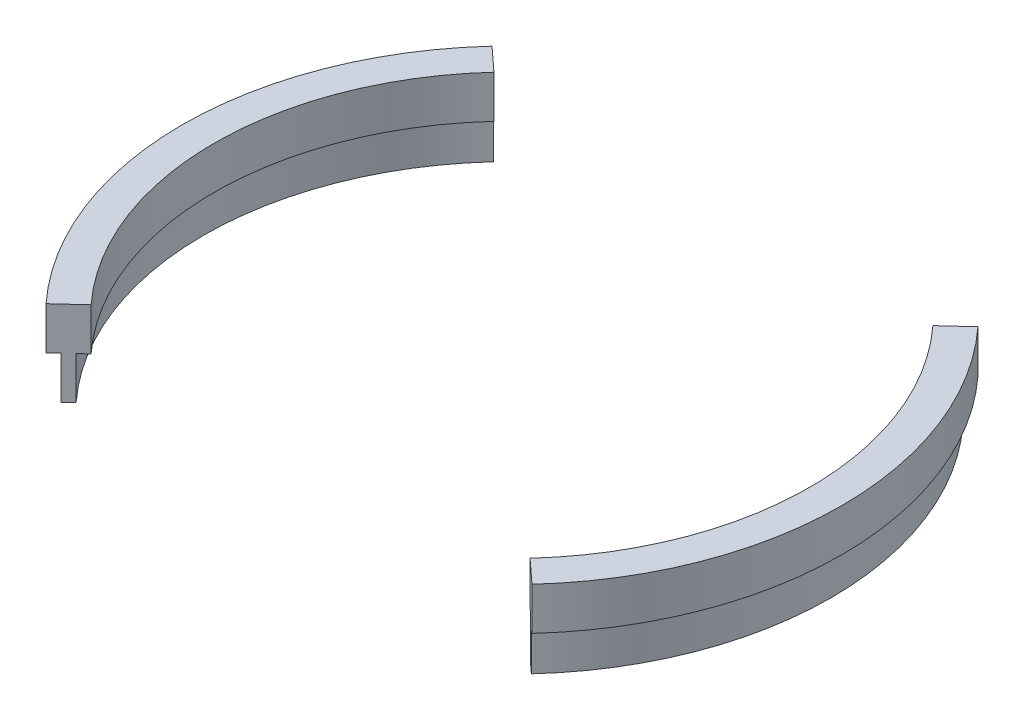
ISO-10303-21;
HEADER;
FILE_DESCRIPTION(('STEP AP214'),'2;1');
FILE_NAME('part.step','',(''),(''),'','','');
FILE_SCHEMA(('AUTOMOTIVE_DESIGN { 1 0 10303 214 1 1 1 1 }'));
ENDSEC;
DATA;
#1=APPLICATION_CONTEXT('core data for automotive mechanical design processes');
#2=APPLICATION_PROTOCOL_DEFINITION('international standard','automotive_design',2000,#1);
#3=PRODUCT_CONTEXT('',#1,'mechanical');
#4=PRODUCT('Part','Part','',(#3));
#5=PRODUCT_RELATED_PRODUCT_CATEGORY('part','',(#4));
#6=PRODUCT_DEFINITION_FORMATION('','',#4);
#7=PRODUCT_DEFINITION_CONTEXT('part definition',#1,'design');
#8=PRODUCT_DEFINITION('design','',#6,#7);
#9=PRODUCT_DEFINITION_SHAPE('','',#8);
#10=(LENGTH_UNIT() NAMED_UNIT(*) SI_UNIT(.MILLI.,.METRE.));
#11=(NAMED_UNIT(*) PLANE_ANGLE_UNIT() SI_UNIT($,.RADIAN.));
#12=(NAMED_UNIT(*) SI_UNIT($,.STERADIAN.) SOLID_ANGLE_UNIT());
#13=UNCERTAINTY_MEASURE_WITH_UNIT(LENGTH_MEASURE(1.E-05),#10,'distance_accuracy_value','');
#14=(GEOMETRIC_REPRESENTATION_CONTEXT(3) GLOBAL_UNCERTAINTY_ASSIGNED_CONTEXT((#13)) GLOBAL_UNIT_ASSIGNED_CONTEXT((#10,
#11,#12)) REPRESENTATION_CONTEXT('',''));
#15=CARTESIAN_POINT('',(0.,0.,0.));
#16=DIRECTION('',(0.,0.,1.));
#17=DIRECTION('',(1.,0.,0.));
#18=AXIS2_PLACEMENT_3D('',#15,#16,#17);
#19=CARTESIAN_POINT('',(1.39496655754129,4.,16.8267841003418));
#20=DIRECTION('',(0.,-1.,0.));
#21=DIRECTION('',(0.,0.,-1.));
#22=AXIS2_PLACEMENT_3D('',#19,#20,#21);
#23=CYLINDRICAL_SURFACE('',#22,29.0000000000001);
#24=CARTESIAN_POINT('',(1.39496655754129,0.,16.8267841003418));
#25=DIRECTION('',(0.,-1.,0.));
#26=DIRECTION('',(0.,0.,1.));
#27=AXIS2_PLACEMENT_3D('',#24,#25,#26);
#28=CIRCLE('',#27,29.0000000000001);
#29=CARTESIAN_POINT('',(-19.9706746071511,0.,36.4356947692597));
#30=VERTEX_POINT('',#29);
#31=CARTESIAN_POINT('',(-19.9706746071511,0.,-2.78212656857616));
#32=VERTEX_POINT('',#31);
#33=EDGE_CURVE('E12',#30,#32,#28,.T.);
#34=ORIENTED_EDGE('',*,*,#33,.T.);
#35=DIRECTION('',(0.,-1.,0.));
#36=VECTOR('',#35,1.);
#37=CARTESIAN_POINT('',(-19.9706746071511,4.,-2.78212656857616));
#38=LINE('',#37,#36);
#39=CARTESIAN_POINT('',(-19.9706746071511,4.,-2.78212656857616));
#40=VERTEX_POINT('',#39);
#41=EDGE_CURVE('E87',#40,#32,#38,.T.);
#42=ORIENTED_EDGE('',*,*,#41,.F.);
#43=CARTESIAN_POINT('',(1.39496655754129,4.,16.8267841003418));
#44=DIRECTION('',(0.,-1.,0.));
#45=DIRECTION('',(0.,0.,1.));
#46=AXIS2_PLACEMENT_3D('',#43,#44,#45);
#47=CIRCLE('',#46,29.0000000000001);
#48=CARTESIAN_POINT('',(-19.9706746071511,4.,36.4356947692597));
#49=VERTEX_POINT('',#48);
#50=EDGE_CURVE('E52',#49,#40,#47,.T.);
#51=ORIENTED_EDGE('',*,*,#50,.F.);
#52=DIRECTION('',(0.,-1.,0.));
#53=VECTOR('',#52,1.);
#54=CARTESIAN_POINT('',(-19.9706746071511,4.,36.4356947692597));
#55=LINE('',#54,#53);
#56=EDGE_CURVE('E163',#49,#30,#55,.T.);
#57=ORIENTED_EDGE('',*,*,#56,.T.);
#58=EDGE_LOOP('',(#34,#42,#51,#57));
#59=FACE_BOUND('',#58,.T.);
#60=ADVANCED_FACE('F47',(#59),#23,.F.);
#61=CARTESIAN_POINT('',(-20.7074208542095,4.,-3.45829590198712));
#62=DIRECTION('',(-0.676169333410963,0.,0.736746247058357));
#63=DIRECTION('',(0.736746247058357,0.,0.676169333410963));
#64=AXIS2_PLACEMENT_3D('',#61,#62,#63);
#65=PLANE('',#64);
#66=DIRECTION('',(-0.736746247058357,0.,-0.676169333410963));
#67=VECTOR('',#66,1.);
#68=CARTESIAN_POINT('',(-20.7074208542095,0.,-3.45829590198712));
#69=LINE('',#68,#67);
#70=CARTESIAN_POINT('',(-20.7074208542095,0.,-3.45829590198712));
#71=VERTEX_POINT('',#70);
#72=EDGE_CURVE('E56',#32,#71,#69,.T.);
#73=ORIENTED_EDGE('',*,*,#72,.T.);
#74=DIRECTION('',(0.,-1.,0.));
#75=VECTOR('',#74,1.);
#76=CARTESIAN_POINT('',(-20.7074208542095,4.,-3.45829590198712));
#77=LINE('',#76,#75);
#78=CARTESIAN_POINT('',(-20.7074208542095,4.,-3.45829590198712));
#79=VERTEX_POINT('',#78);
#80=EDGE_CURVE('E81',#79,#71,#77,.T.);
#81=ORIENTED_EDGE('',*,*,#80,.F.);
#82=DIRECTION('',(-0.736746247058359,0.,-0.676169333410962));
#83=VECTOR('',#82,1.);
#84=CARTESIAN_POINT('',(-21.4441671012583,4.,-4.13446523540854));
#85=LINE('',#84,#83);
#86=CARTESIAN_POINT('',(-21.4441671012583,4.,-4.13446523540854));
#87=VERTEX_POINT('',#86);
#88=EDGE_CURVE('E123',#79,#87,#85,.T.);
#89=ORIENTED_EDGE('',*,*,#88,.T.);
#90=DIRECTION('',(0.,-1.,0.));
#91=VECTOR('',#90,1.);
#92=CARTESIAN_POINT('',(-21.4441671012583,8.,-4.13446523540854));
#93=LINE('',#92,#91);
#94=CARTESIAN_POINT('',(-21.4441671012583,8.,-4.13446523540854));
#95=VERTEX_POINT('',#94);
#96=EDGE_CURVE('E126',#95,#87,#93,.T.);
#97=ORIENTED_EDGE('',*,*,#96,.F.);
#98=DIRECTION('',(-0.736746247058359,0.,-0.676169333410962));
#99=VECTOR('',#98,1.);
#100=CARTESIAN_POINT('',(-21.4441671012583,8.,-4.13446523540854));
#101=LINE('',#100,#99);
#102=CARTESIAN_POINT('',(-19.2339283600832,8.,-2.10595723517566));
#103=VERTEX_POINT('',#102);
#104=EDGE_CURVE('E142',#103,#95,#101,.T.);
#105=ORIENTED_EDGE('',*,*,#104,.F.);
#106=DIRECTION('',(0.,-1.,0.));
#107=VECTOR('',#106,1.);
#108=CARTESIAN_POINT('',(-19.2339283600832,8.,-2.10595723517566));
#109=LINE('',#108,#107);
#110=CARTESIAN_POINT('',(-19.2339283600832,4.,-2.10595723517566));
#111=VERTEX_POINT('',#110);
#112=EDGE_CURVE('E141',#103,#111,#109,.T.);
#113=ORIENTED_EDGE('',*,*,#112,.T.);
#114=EDGE_CURVE('E134',#111,#40,#85,.T.);
#115=ORIENTED_EDGE('',*,*,#114,.T.);
#116=ORIENTED_EDGE('',*,*,#41,.T.);
#117=EDGE_LOOP('',(#73,#81,#89,#97,#105,#113,#115,#116));
#118=FACE_BOUND('',#117,.T.);
#119=ADVANCED_FACE('F127',(#118),#65,.F.);
#120=CARTESIAN_POINT('',(1.39496655754129,4.,16.8267841003418));
#121=DIRECTION('',(0.,-1.,0.));
#122=DIRECTION('',(0.,0.,-1.));
#123=AXIS2_PLACEMENT_3D('',#120,#121,#122);
#124=CYLINDRICAL_SURFACE('',#123,30.0000000000001);
#125=CARTESIAN_POINT('',(1.39496655754129,0.,16.8267841003418));
#126=DIRECTION('',(0.,1.,0.));
#127=DIRECTION('',(0.,0.,1.));
#128=AXIS2_PLACEMENT_3D('',#125,#126,#127);
#129=CIRCLE('',#128,30.0000000000001);
#130=CARTESIAN_POINT('',(-20.7074208542095,0.,37.1118641026707));
#131=VERTEX_POINT('',#130);
#132=EDGE_CURVE('E169',#71,#131,#129,.T.);
#133=ORIENTED_EDGE('',*,*,#132,.T.);
#134=DIRECTION('',(0.,-1.,0.));
#135=VECTOR('',#134,1.);
#136=CARTESIAN_POINT('',(-20.7074208542095,4.,37.1118641026707));
#137=LINE('',#136,#135);
#138=CARTESIAN_POINT('',(-20.7074208542191,4.,37.1118641026602));
#139=VERTEX_POINT('',#138);
#140=EDGE_CURVE('E165',#139,#131,#137,.T.);
#141=ORIENTED_EDGE('',*,*,#140,.F.);
#142=CARTESIAN_POINT('',(1.39496655754129,4.,16.8267841003418));
#143=DIRECTION('',(0.,1.,0.));
#144=DIRECTION('',(0.,0.,1.));
#145=AXIS2_PLACEMENT_3D('',#142,#143,#144);
#146=CIRCLE('',#145,30.0000000000001);
#147=EDGE_CURVE('E167',#79,#139,#146,.T.);
#148=ORIENTED_EDGE('',*,*,#147,.F.);
#149=ORIENTED_EDGE('',*,*,#80,.T.);
#150=EDGE_LOOP('',(#133,#141,#148,#149));
#151=FACE_BOUND('',#150,.T.);
#152=ADVANCED_FACE('F210',(#151),#124,.T.);
#153=CARTESIAN_POINT('',(-20.7074208542095,4.,37.1118641026707));
#154=DIRECTION('',(-0.676169333410963,0.,-0.736746247058357));
#155=DIRECTION('',(-0.736746247058357,0.,0.676169333410963));
#156=AXIS2_PLACEMENT_3D('',#153,#154,#155);
#157=PLANE('',#156);
#158=DIRECTION('',(0.736746247058357,0.,-0.676169333410963));
#159=VECTOR('',#158,1.);
#160=CARTESIAN_POINT('',(-20.7074208542095,0.,37.1118641026707));
#161=LINE('',#160,#159);
#162=EDGE_CURVE('E94',#131,#30,#161,.T.);
#163=ORIENTED_EDGE('',*,*,#162,.T.);
#164=ORIENTED_EDGE('',*,*,#56,.F.);
#165=DIRECTION('',(0.736746247058359,0.,-0.676169333410962));
#166=VECTOR('',#165,1.);
#167=CARTESIAN_POINT('',(-19.2339283601024,4.,35.7595254358383));
#168=LINE('',#167,#166);
#169=CARTESIAN_POINT('',(-19.2339283601024,4.,35.7595254358383));
#170=VERTEX_POINT('',#169);
#171=EDGE_CURVE('E151',#49,#170,#168,.T.);
#172=ORIENTED_EDGE('',*,*,#171,.T.);
#173=DIRECTION('',(0.,-1.,0.));
#174=VECTOR('',#173,1.);
#175=CARTESIAN_POINT('',(-19.2339283601024,8.,35.7595254358383));
#176=LINE('',#175,#174);
#177=CARTESIAN_POINT('',(-19.2339283601024,8.,35.7595254358383));
#178=VERTEX_POINT('',#177);
#179=EDGE_CURVE('E182',#178,#170,#176,.T.);
#180=ORIENTED_EDGE('',*,*,#179,.F.);
#181=DIRECTION('',(0.736746247058359,0.,-0.676169333410962));
#182=VECTOR('',#181,1.);
#183=CARTESIAN_POINT('',(-19.2339283601024,8.,35.7595254358383));
#184=LINE('',#183,#182);
#185=CARTESIAN_POINT('',(-21.4441671012775,8.,37.7880334360712));
#186=VERTEX_POINT('',#185);
#187=EDGE_CURVE('E158',#186,#178,#184,.T.);
#188=ORIENTED_EDGE('',*,*,#187,.F.);
#189=DIRECTION('',(0.,-1.,0.));
#190=VECTOR('',#189,1.);
#191=CARTESIAN_POINT('',(-21.4441671012775,8.,37.7880334360712));
#192=LINE('',#191,#190);
#193=CARTESIAN_POINT('',(-21.4441671012775,4.,37.7880334360712));
#194=VERTEX_POINT('',#193);
#195=EDGE_CURVE('E184',#186,#194,#192,.T.);
#196=ORIENTED_EDGE('',*,*,#195,.T.);
#197=EDGE_CURVE('E150',#194,#139,#168,.T.);
#198=ORIENTED_EDGE('',*,*,#197,.T.);
#199=ORIENTED_EDGE('',*,*,#140,.T.);
#200=EDGE_LOOP('',(#163,#164,#172,#180,#188,#196,#198,#199));
#201=FACE_BOUND('',#200,.T.);
#202=ADVANCED_FACE('F183',(#201),#157,.F.);
#203=CARTESIAN_POINT('',(1.39496655754129,0.,16.8267841003418));
#204=DIRECTION('',(0.,1.,0.));
#205=DIRECTION('',(0.,0.,1.));
#206=AXIS2_PLACEMENT_3D('',#203,#204,#205);
#207=PLANE('',#206);
#208=ORIENTED_EDGE('',*,*,#33,.F.);
#209=ORIENTED_EDGE('',*,*,#162,.F.);
#210=ORIENTED_EDGE('',*,*,#132,.F.);
#211=ORIENTED_EDGE('',*,*,#72,.F.);
#212=EDGE_LOOP('',(#208,#209,#210,#211));
#213=FACE_BOUND('',#212,.T.);
#214=ADVANCED_FACE('F51',(#213),#207,.F.);
#215=CARTESIAN_POINT('',(1.39496655754129,4.,16.8267841003418));
#216=DIRECTION('',(0.,1.,0.));
#217=DIRECTION('',(0.,0.,1.));
#218=AXIS2_PLACEMENT_3D('',#215,#216,#217);
#219=PLANE('',#218);
#220=ORIENTED_EDGE('',*,*,#171,.F.);
#221=ORIENTED_EDGE('',*,*,#50,.T.);
#222=ORIENTED_EDGE('',*,*,#114,.F.);
#223=CARTESIAN_POINT('',(1.39496655754129,4.,16.8267841003418));
#224=DIRECTION('',(0.,-1.,0.));
#225=DIRECTION('',(0.,0.,1.));
#226=AXIS2_PLACEMENT_3D('',#223,#224,#225);
#227=CIRCLE('',#226,28.0000000000001);
#228=EDGE_CURVE('E179',#170,#111,#227,.T.);
#229=ORIENTED_EDGE('',*,*,#228,.F.);
#230=EDGE_LOOP('',(#220,#221,#222,#229));
#231=FACE_BOUND('',#230,.T.);
#232=ADVANCED_FACE('F171',(#231),#219,.F.);
#233=CARTESIAN_POINT('',(1.39496655754129,8.,16.8267841003418));
#234=DIRECTION('',(0.,-1.,0.));
#235=DIRECTION('',(0.,0.,-1.));
#236=AXIS2_PLACEMENT_3D('',#233,#234,#235);
#237=CYLINDRICAL_SURFACE('',#236,31.0000000000001);
#238=CARTESIAN_POINT('',(1.39496655754129,4.,16.8267841003418));
#239=DIRECTION('',(0.,1.,0.));
#240=DIRECTION('',(0.,0.,1.));
#241=AXIS2_PLACEMENT_3D('',#238,#239,#240);
#242=CIRCLE('',#241,31.0000000000001);
#243=EDGE_CURVE('E140',#87,#194,#242,.T.);
#244=ORIENTED_EDGE('',*,*,#243,.T.);
#245=ORIENTED_EDGE('',*,*,#195,.F.);
#246=CARTESIAN_POINT('',(1.39496655754129,8.,16.8267841003418));
#247=DIRECTION('',(0.,1.,0.));
#248=DIRECTION('',(0.,0.,1.));
#249=AXIS2_PLACEMENT_3D('',#246,#247,#248);
#250=CIRCLE('',#249,31.0000000000001);
#251=EDGE_CURVE('E131',#95,#186,#250,.T.);
#252=ORIENTED_EDGE('',*,*,#251,.F.);
#253=ORIENTED_EDGE('',*,*,#96,.T.);
#254=EDGE_LOOP('',(#244,#245,#252,#253));
#255=FACE_BOUND('',#254,.T.);
#256=ADVANCED_FACE('F139',(#255),#237,.T.);
#257=CARTESIAN_POINT('',(1.39496655754129,8.,16.8267841003418));
#258=DIRECTION('',(0.,-1.,0.));
#259=DIRECTION('',(0.,0.,-1.));
#260=AXIS2_PLACEMENT_3D('',#257,#258,#259);
#261=CYLINDRICAL_SURFACE('',#260,28.0000000000001);
#262=ORIENTED_EDGE('',*,*,#228,.T.);
#263=ORIENTED_EDGE('',*,*,#112,.F.);
#264=CARTESIAN_POINT('',(1.39496655754129,8.,16.8267841003418));
#265=DIRECTION('',(0.,-1.,0.));
#266=DIRECTION('',(0.,0.,1.));
#267=AXIS2_PLACEMENT_3D('',#264,#265,#266);
#268=CIRCLE('',#267,28.0000000000001);
#269=EDGE_CURVE('E156',#178,#103,#268,.T.);
#270=ORIENTED_EDGE('',*,*,#269,.F.);
#271=ORIENTED_EDGE('',*,*,#179,.T.);
#272=EDGE_LOOP('',(#262,#263,#270,#271));
#273=FACE_BOUND('',#272,.T.);
#274=ADVANCED_FACE('F191',(#273),#261,.F.);
#275=CARTESIAN_POINT('',(1.39496655754129,8.,16.8267841003418));
#276=DIRECTION('',(0.,1.,0.));
#277=DIRECTION('',(0.,0.,1.));
#278=AXIS2_PLACEMENT_3D('',#275,#276,#277);
#279=PLANE('',#278);
#280=ORIENTED_EDGE('',*,*,#251,.T.);
#281=ORIENTED_EDGE('',*,*,#187,.T.);
#282=ORIENTED_EDGE('',*,*,#269,.T.);
#283=ORIENTED_EDGE('',*,*,#104,.T.);
#284=EDGE_LOOP('',(#280,#281,#282,#283));
#285=FACE_BOUND('',#284,.T.);
#286=ADVANCED_FACE('F186',(#285),#279,.T.);
#287=ORIENTED_EDGE('',*,*,#88,.F.);
#288=ORIENTED_EDGE('',*,*,#147,.T.);
#289=ORIENTED_EDGE('',*,*,#197,.F.);
#290=ORIENTED_EDGE('',*,*,#243,.F.);
#291=EDGE_LOOP('',(#287,#288,#289,#290));
#292=FACE_BOUND('',#291,.T.);
#293=ADVANCED_FACE('F144',(#292),#219,.F.);
#294=CLOSED_SHELL('',(#60,#119,#152,#202,#214,#232,#256,#274,#286,#293));
#295=MANIFOLD_SOLID_BREP('B2',#294);
#296=CARTESIAN_POINT('',(1.39496655754129,4.,16.8267841003418));
#297=DIRECTION('',(0.,-1.,0.));
#298=DIRECTION('',(0.,0.,-1.));
#299=AXIS2_PLACEMENT_3D('',#296,#297,#298);
#300=CYLINDRICAL_SURFACE('',#299,29.0000000000001);
#301=CARTESIAN_POINT('',(1.39496655754129,0.,16.8267841003418));
#302=DIRECTION('',(0.,-1.,0.));
#303=DIRECTION('',(0.,0.,1.));
#304=AXIS2_PLACEMENT_3D('',#301,#302,#303);
#305=CIRCLE('',#304,29.0000000000001);
#306=CARTESIAN_POINT('',(22.7606077222337,0.,-2.78212656857616));
#307=VERTEX_POINT('',#306);
#308=CARTESIAN_POINT('',(22.7606077222337,0.,36.4356947692597));
#309=VERTEX_POINT('',#308);
#310=EDGE_CURVE('E376',#307,#309,#305,.T.);
#311=ORIENTED_EDGE('',*,*,#310,.T.);
#312=DIRECTION('',(0.,-1.,0.));
#313=VECTOR('',#312,1.);
#314=CARTESIAN_POINT('',(22.7606077222337,4.,36.4356947692597));
#315=LINE('',#314,#313);
#316=CARTESIAN_POINT('',(22.7606077222337,4.,36.4356947692597));
#317=VERTEX_POINT('',#316);
#318=EDGE_CURVE('E50',#317,#309,#315,.T.);
#319=ORIENTED_EDGE('',*,*,#318,.F.);
#320=CARTESIAN_POINT('',(1.39496655754129,4.,16.8267841003418));
#321=DIRECTION('',(0.,-1.,0.));
#322=DIRECTION('',(0.,0.,1.));
#323=AXIS2_PLACEMENT_3D('',#320,#321,#322);
#324=CIRCLE('',#323,29.0000000000001);
#325=CARTESIAN_POINT('',(22.7606077222337,4.,-2.78212656857616));
#326=VERTEX_POINT('',#325);
#327=EDGE_CURVE('E383',#326,#317,#324,.T.);
#328=ORIENTED_EDGE('',*,*,#327,.F.);
#329=DIRECTION('',(0.,-1.,0.));
#330=VECTOR('',#329,1.);
#331=CARTESIAN_POINT('',(22.7606077222337,4.,-2.78212656857616));
#332=LINE('',#331,#330);
#333=EDGE_CURVE('E297',#326,#307,#332,.T.);
#334=ORIENTED_EDGE('',*,*,#333,.T.);
#335=EDGE_LOOP('',(#311,#319,#328,#334));
#336=FACE_BOUND('',#335,.T.);
#337=ADVANCED_FACE('F278',(#336),#300,.F.);
#338=CARTESIAN_POINT('',(22.7606077222337,4.,36.4356947692597));
#339=DIRECTION('',(0.676169333411043,0.,-0.736746247058284));
#340=DIRECTION('',(-0.736746247058284,0.,-0.676169333411043));
#341=AXIS2_PLACEMENT_3D('',#338,#339,#340);
#342=PLANE('',#341);
#343=DIRECTION('',(0.736746247058284,0.,0.676169333411043));
#344=VECTOR('',#343,1.);
#345=CARTESIAN_POINT('',(22.7606077222337,0.,36.4356947692597));
#346=LINE('',#345,#344);
#347=CARTESIAN_POINT('',(23.497353969292,0.,37.1118641026708));
#348=VERTEX_POINT('',#347);
#349=EDGE_CURVE('E378',#309,#348,#346,.T.);
#350=ORIENTED_EDGE('',*,*,#349,.T.);
#351=DIRECTION('',(0.,-1.,0.));
#352=VECTOR('',#351,1.);
#353=CARTESIAN_POINT('',(23.497353969292,4.,37.1118641026708));
#354=LINE('',#353,#352);
#355=CARTESIAN_POINT('',(23.497353969292,4.,37.1118641026708));
#356=VERTEX_POINT('',#355);
#357=EDGE_CURVE('E289',#356,#348,#354,.T.);
#358=ORIENTED_EDGE('',*,*,#357,.F.);
#359=DIRECTION('',(0.736746247058359,0.,0.676169333410962));
#360=VECTOR('',#359,1.);
#361=CARTESIAN_POINT('',(22.023861475185,4.,35.7595254358383));
#362=LINE('',#361,#360);
#363=CARTESIAN_POINT('',(24.2341002163601,4.,37.7880334360712));
#364=VERTEX_POINT('',#363);
#365=EDGE_CURVE('E419',#356,#364,#362,.T.);
#366=ORIENTED_EDGE('',*,*,#365,.T.);
#367=DIRECTION('',(0.,-1.,0.));
#368=VECTOR('',#367,1.);
#369=CARTESIAN_POINT('',(24.2341002163601,8.,37.7880334360712));
#370=LINE('',#369,#368);
#371=CARTESIAN_POINT('',(24.2341002163601,8.,37.7880334360712));
#372=VERTEX_POINT('',#371);
#373=EDGE_CURVE('E359',#372,#364,#370,.T.);
#374=ORIENTED_EDGE('',*,*,#373,.F.);
#375=DIRECTION('',(0.736746247058359,0.,0.676169333410962));
#376=VECTOR('',#375,1.);
#377=CARTESIAN_POINT('',(22.023861475185,8.,35.7595254358383));
#378=LINE('',#377,#376);
#379=CARTESIAN_POINT('',(22.023861475185,8.,35.7595254358383));
#380=VERTEX_POINT('',#379);
#381=EDGE_CURVE('E348',#380,#372,#378,.T.);
#382=ORIENTED_EDGE('',*,*,#381,.F.);
#383=DIRECTION('',(0.,-1.,0.));
#384=VECTOR('',#383,1.);
#385=CARTESIAN_POINT('',(22.023861475185,8.,35.7595254358383));
#386=LINE('',#385,#384);
#387=CARTESIAN_POINT('',(22.023861475185,4.,35.7595254358383));
#388=VERTEX_POINT('',#387);
#389=EDGE_CURVE('E353',#380,#388,#386,.T.);
#390=ORIENTED_EDGE('',*,*,#389,.T.);
#391=EDGE_CURVE('E410',#388,#317,#362,.T.);
#392=ORIENTED_EDGE('',*,*,#391,.T.);
#393=ORIENTED_EDGE('',*,*,#318,.T.);
#394=EDGE_LOOP('',(#350,#358,#366,#374,#382,#390,#392,#393));
#395=FACE_BOUND('',#394,.T.);
#396=ADVANCED_FACE('F355',(#395),#342,.F.);
#397=CARTESIAN_POINT('',(1.39496655754129,4.,16.8267841003418));
#398=DIRECTION('',(0.,-1.,0.));
#399=DIRECTION('',(0.,0.,-1.));
#400=AXIS2_PLACEMENT_3D('',#397,#398,#399);
#401=CYLINDRICAL_SURFACE('',#400,30.0000000000001);
#402=CARTESIAN_POINT('',(1.39496655754129,0.,16.8267841003418));
#403=DIRECTION('',(0.,1.,0.));
#404=DIRECTION('',(0.,0.,1.));
#405=AXIS2_PLACEMENT_3D('',#402,#403,#404);
#406=CIRCLE('',#405,30.0000000000001);
#407=CARTESIAN_POINT('',(23.497353969292,0.,-3.4582959019872));
#408=VERTEX_POINT('',#407);
#409=EDGE_CURVE('E312',#348,#408,#406,.T.);
#410=ORIENTED_EDGE('',*,*,#409,.T.);
#411=DIRECTION('',(0.,-1.,0.));
#412=VECTOR('',#411,1.);
#413=CARTESIAN_POINT('',(23.497353969292,4.,-3.4582959019872));
#414=LINE('',#413,#412);
#415=CARTESIAN_POINT('',(23.4973539692825,4.,-3.45829590199759));
#416=VERTEX_POINT('',#415);
#417=EDGE_CURVE('E394',#416,#408,#414,.T.);
#418=ORIENTED_EDGE('',*,*,#417,.F.);
#419=CARTESIAN_POINT('',(1.39496655754129,4.,16.8267841003418));
#420=DIRECTION('',(0.,1.,0.));
#421=DIRECTION('',(0.,0.,1.));
#422=AXIS2_PLACEMENT_3D('',#419,#420,#421);
#423=CIRCLE('',#422,30.0000000000001);
#424=EDGE_CURVE('E387',#356,#416,#423,.T.);
#425=ORIENTED_EDGE('',*,*,#424,.F.);
#426=ORIENTED_EDGE('',*,*,#357,.T.);
#427=EDGE_LOOP('',(#410,#418,#425,#426));
#428=FACE_BOUND('',#427,.T.);
#429=ADVANCED_FACE('F393',(#428),#401,.T.);
#430=CARTESIAN_POINT('',(22.7606077222337,4.,-2.78212656857616));
#431=DIRECTION('',(0.676169333411037,0.,0.736746247058289));
#432=DIRECTION('',(0.736746247058289,0.,-0.676169333411037));
#433=AXIS2_PLACEMENT_3D('',#430,#431,#432);
#434=PLANE('',#433);
#435=DIRECTION('',(-0.736746247058289,0.,0.676169333411037));
#436=VECTOR('',#435,1.);
#437=CARTESIAN_POINT('',(22.7606077222337,0.,-2.78212656857616));
#438=LINE('',#437,#436);
#439=EDGE_CURVE('E318',#408,#307,#438,.T.);
#440=ORIENTED_EDGE('',*,*,#439,.T.);
#441=ORIENTED_EDGE('',*,*,#333,.F.);
#442=DIRECTION('',(-0.736746247058358,0.,0.676169333410962));
#443=VECTOR('',#442,1.);
#444=CARTESIAN_POINT('',(24.2341002163408,4.,-4.13446523540856));
#445=LINE('',#444,#443);
#446=CARTESIAN_POINT('',(22.0238614751658,4.,-2.10595723517567));
#447=VERTEX_POINT('',#446);
#448=EDGE_CURVE('E405',#326,#447,#445,.T.);
#449=ORIENTED_EDGE('',*,*,#448,.T.);
#450=DIRECTION('',(0.,-1.,0.));
#451=VECTOR('',#450,1.);
#452=CARTESIAN_POINT('',(22.0238614751658,8.,-2.10595723517567));
#453=LINE('',#452,#451);
#454=CARTESIAN_POINT('',(22.0238614751658,8.,-2.10595723517567));
#455=VERTEX_POINT('',#454);
#456=EDGE_CURVE('E411',#455,#447,#453,.T.);
#457=ORIENTED_EDGE('',*,*,#456,.F.);
#458=DIRECTION('',(-0.736746247058358,0.,0.676169333410962));
#459=VECTOR('',#458,1.);
#460=CARTESIAN_POINT('',(24.2341002163408,8.,-4.13446523540856));
#461=LINE('',#460,#459);
#462=CARTESIAN_POINT('',(24.2341002163408,8.,-4.13446523540856));
#463=VERTEX_POINT('',#462);
#464=EDGE_CURVE('E370',#463,#455,#461,.T.);
#465=ORIENTED_EDGE('',*,*,#464,.F.);
#466=DIRECTION('',(0.,-1.,0.));
#467=VECTOR('',#466,1.);
#468=CARTESIAN_POINT('',(24.2341002163408,8.,-4.13446523540856));
#469=LINE('',#468,#467);
#470=CARTESIAN_POINT('',(24.2341002163408,4.,-4.13446523540856));
#471=VERTEX_POINT('',#470);
#472=EDGE_CURVE('E379',#463,#471,#469,.T.);
#473=ORIENTED_EDGE('',*,*,#472,.T.);
#474=EDGE_CURVE('E371',#471,#416,#445,.T.);
#475=ORIENTED_EDGE('',*,*,#474,.T.);
#476=ORIENTED_EDGE('',*,*,#417,.T.);
#477=EDGE_LOOP('',(#440,#441,#449,#457,#465,#473,#475,#476));
#478=FACE_BOUND('',#477,.T.);
#479=ADVANCED_FACE('F415',(#478),#434,.F.);
#480=CARTESIAN_POINT('',(1.39496655754129,0.,16.8267841003418));
#481=DIRECTION('',(0.,1.,0.));
#482=DIRECTION('',(0.,0.,1.));
#483=AXIS2_PLACEMENT_3D('',#480,#481,#482);
#484=PLANE('',#483);
#485=ORIENTED_EDGE('',*,*,#310,.F.);
#486=ORIENTED_EDGE('',*,*,#439,.F.);
#487=ORIENTED_EDGE('',*,*,#409,.F.);
#488=ORIENTED_EDGE('',*,*,#349,.F.);
#489=EDGE_LOOP('',(#485,#486,#487,#488));
#490=FACE_BOUND('',#489,.T.);
#491=ADVANCED_FACE('F398',(#490),#484,.F.);
#492=CARTESIAN_POINT('',(1.39496655754129,4.,16.8267841003418));
#493=DIRECTION('',(0.,1.,0.));
#494=DIRECTION('',(0.,0.,1.));
#495=AXIS2_PLACEMENT_3D('',#492,#493,#494);
#496=PLANE('',#495);
#497=ORIENTED_EDGE('',*,*,#448,.F.);
#498=ORIENTED_EDGE('',*,*,#327,.T.);
#499=ORIENTED_EDGE('',*,*,#391,.F.);
#500=CARTESIAN_POINT('',(1.39496655754129,4.,16.8267841003418));
#501=DIRECTION('',(0.,-1.,0.));
#502=DIRECTION('',(0.,0.,1.));
#503=AXIS2_PLACEMENT_3D('',#500,#501,#502);
#504=CIRCLE('',#503,28.0000000000001);
#505=EDGE_CURVE('E374',#447,#388,#504,.T.);
#506=ORIENTED_EDGE('',*,*,#505,.F.);
#507=EDGE_LOOP('',(#497,#498,#499,#506));
#508=FACE_BOUND('',#507,.T.);
#509=ADVANCED_FACE('F401',(#508),#496,.F.);
#510=CARTESIAN_POINT('',(1.39496655754129,8.,16.8267841003418));
#511=DIRECTION('',(0.,-1.,0.));
#512=DIRECTION('',(0.,0.,-1.));
#513=AXIS2_PLACEMENT_3D('',#510,#511,#512);
#514=CYLINDRICAL_SURFACE('',#513,28.0000000000001);
#515=ORIENTED_EDGE('',*,*,#505,.T.);
#516=ORIENTED_EDGE('',*,*,#389,.F.);
#517=CARTESIAN_POINT('',(1.39496655754129,8.,16.8267841003418));
#518=DIRECTION('',(0.,-1.,0.));
#519=DIRECTION('',(0.,0.,1.));
#520=AXIS2_PLACEMENT_3D('',#517,#518,#519);
#521=CIRCLE('',#520,28.0000000000001);
#522=EDGE_CURVE('E362',#455,#380,#521,.T.);
#523=ORIENTED_EDGE('',*,*,#522,.F.);
#524=ORIENTED_EDGE('',*,*,#456,.T.);
#525=EDGE_LOOP('',(#515,#516,#523,#524));
#526=FACE_BOUND('',#525,.T.);
#527=ADVANCED_FACE('F373',(#526),#514,.F.);
#528=CARTESIAN_POINT('',(1.39496655754129,8.,16.8267841003418));
#529=DIRECTION('',(0.,-1.,0.));
#530=DIRECTION('',(0.,0.,-1.));
#531=AXIS2_PLACEMENT_3D('',#528,#529,#530);
#532=CYLINDRICAL_SURFACE('',#531,31.0000000000001);
#533=CARTESIAN_POINT('',(1.39496655754129,4.,16.8267841003418));
#534=DIRECTION('',(0.,1.,0.));
#535=DIRECTION('',(0.,0.,1.));
#536=AXIS2_PLACEMENT_3D('',#533,#534,#535);
#537=CIRCLE('',#536,31.0000000000001);
#538=EDGE_CURVE('E404',#364,#471,#537,.T.);
#539=ORIENTED_EDGE('',*,*,#538,.T.);
#540=ORIENTED_EDGE('',*,*,#472,.F.);
#541=CARTESIAN_POINT('',(1.39496655754129,8.,16.8267841003418));
#542=DIRECTION('',(0.,1.,0.));
#543=DIRECTION('',(0.,0.,1.));
#544=AXIS2_PLACEMENT_3D('',#541,#542,#543);
#545=CIRCLE('',#544,31.0000000000001);
#546=EDGE_CURVE('E363',#372,#463,#545,.T.);
#547=ORIENTED_EDGE('',*,*,#546,.F.);
#548=ORIENTED_EDGE('',*,*,#373,.T.);
#549=EDGE_LOOP('',(#539,#540,#547,#548));
#550=FACE_BOUND('',#549,.T.);
#551=ADVANCED_FACE('F424',(#550),#532,.T.);
#552=CARTESIAN_POINT('',(1.39496655754129,8.,16.8267841003418));
#553=DIRECTION('',(0.,1.,0.));
#554=DIRECTION('',(0.,0.,1.));
#555=AXIS2_PLACEMENT_3D('',#552,#553,#554);
#556=PLANE('',#555);
#557=ORIENTED_EDGE('',*,*,#522,.T.);
#558=ORIENTED_EDGE('',*,*,#381,.T.);
#559=ORIENTED_EDGE('',*,*,#546,.T.);
#560=ORIENTED_EDGE('',*,*,#464,.T.);
#561=EDGE_LOOP('',(#557,#558,#559,#560));
#562=FACE_BOUND('',#561,.T.);
#563=ADVANCED_FACE('F364',(#562),#556,.T.);
#564=ORIENTED_EDGE('',*,*,#365,.F.);
#565=ORIENTED_EDGE('',*,*,#424,.T.);
#566=ORIENTED_EDGE('',*,*,#474,.F.);
#567=ORIENTED_EDGE('',*,*,#538,.F.);
#568=EDGE_LOOP('',(#564,#565,#566,#567));
#569=FACE_BOUND('',#568,.T.);
#570=ADVANCED_FACE('F420',(#569),#496,.F.);
#571=CLOSED_SHELL('',(#337,#396,#429,#479,#491,#509,#527,#551,#563,#570));
#572=MANIFOLD_SOLID_BREP('B6',#571);
#573=ADVANCED_BREP_SHAPE_REPRESENTATION('',(#18,#295,#572),#14);
#574=SHAPE_DEFINITION_REPRESENTATION(#9,#573);
ENDSEC;
END-ISO-10303-21;
